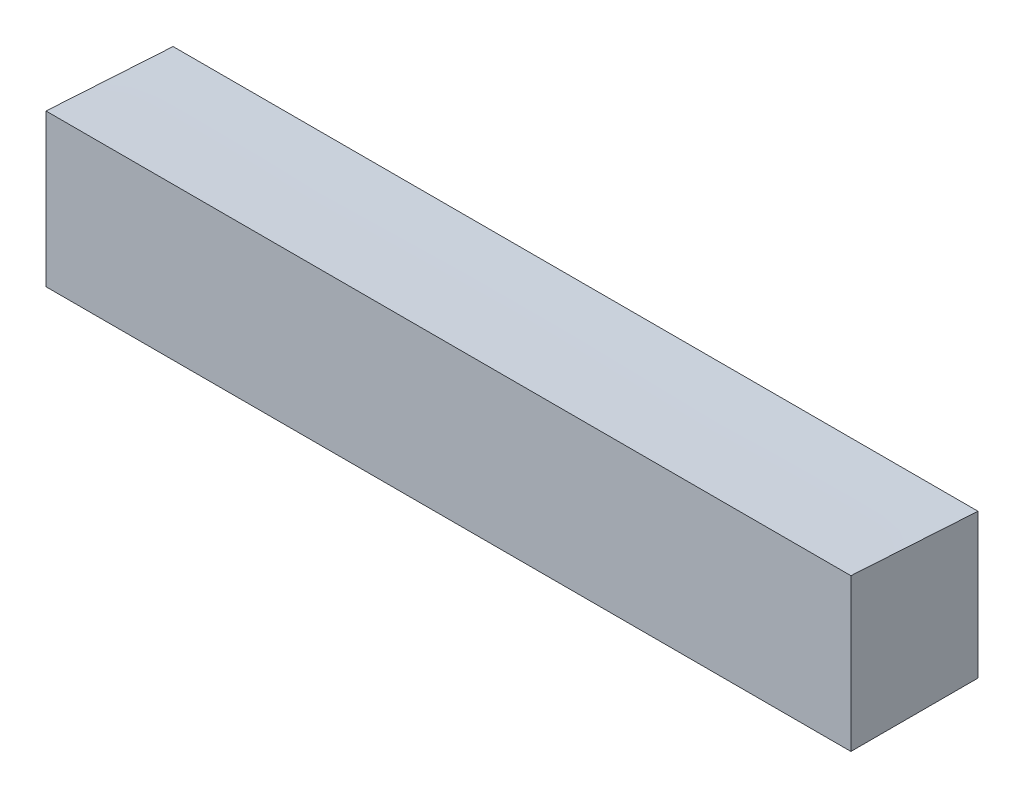
ISO-10303-21;
HEADER;
FILE_DESCRIPTION(('STEP AP214'),'2;1');
FILE_NAME('part.step','',(''),(''),'','','');
FILE_SCHEMA(('AUTOMOTIVE_DESIGN { 1 0 10303 214 1 1 1 1 }'));
ENDSEC;
DATA;
#1=APPLICATION_CONTEXT('core data for automotive mechanical design processes');
#2=APPLICATION_PROTOCOL_DEFINITION('international standard','automotive_design',2000,#1);
#3=PRODUCT_CONTEXT('',#1,'mechanical');
#4=PRODUCT('Part','Part','',(#3));
#5=PRODUCT_RELATED_PRODUCT_CATEGORY('part','',(#4));
#6=PRODUCT_DEFINITION_FORMATION('','',#4);
#7=PRODUCT_DEFINITION_CONTEXT('part definition',#1,'design');
#8=PRODUCT_DEFINITION('design','',#6,#7);
#9=PRODUCT_DEFINITION_SHAPE('','',#8);
#10=(LENGTH_UNIT() NAMED_UNIT(*) SI_UNIT(.MILLI.,.METRE.));
#11=(NAMED_UNIT(*) PLANE_ANGLE_UNIT() SI_UNIT($,.RADIAN.));
#12=(NAMED_UNIT(*) SI_UNIT($,.STERADIAN.) SOLID_ANGLE_UNIT());
#13=UNCERTAINTY_MEASURE_WITH_UNIT(LENGTH_MEASURE(1.E-05),#10,'distance_accuracy_value','');
#14=(GEOMETRIC_REPRESENTATION_CONTEXT(3) GLOBAL_UNCERTAINTY_ASSIGNED_CONTEXT((#13)) GLOBAL_UNIT_ASSIGNED_CONTEXT((#10,
#11,#12)) REPRESENTATION_CONTEXT('',''));
#15=CARTESIAN_POINT('',(0.,0.,0.));
#16=DIRECTION('',(0.,0.,1.));
#17=DIRECTION('',(1.,0.,0.));
#18=AXIS2_PLACEMENT_3D('',#15,#16,#17);
#19=CARTESIAN_POINT('',(-200.,-196.883488142695,0.));
#20=CARTESIAN_POINT('',(-200.,-189.069163208415,-93.0446551492894));
#21=CARTESIAN_POINT('',(-200.,-207.243937597042,-302.610093537368));
#22=CARTESIAN_POINT('',(-200.,-209.075197803941,-413.146581257138));
#23=CARTESIAN_POINT('',(-200.,-149.907972883575,-472.384774493397));
#24=CARTESIAN_POINT('',(-200.,-57.0358984147016,-361.760258551688));
#25=CARTESIAN_POINT('',(-200.,250.000000000014,-480.000000000005));
#26=B_SPLINE_CURVE_WITH_KNOTS('',3,(#19,#20,#21,#22,#23,#24,#25),.UNSPECIFIED.,.F.,.F.,(4,1,1,1,
4),(0.,0.361871867439847,0.526261734758969,0.755385014590914,1.),.UNSPECIFIED.);
#27=DIRECTION('',(1.,0.,0.));
#28=VECTOR('',#27,1.);
#29=SURFACE_OF_LINEAR_EXTRUSION('',#26,#28);
#30=OFFSET_SURFACE('',#29,10.,.F.);
#31=DIRECTION('',(1.,0.,0.));
#32=VECTOR('',#31,1.);
#33=CARTESIAN_POINT('',(1.67918436749914E-13,-214.063970017158,-285.));
#34=LINE('',#33,#32);
#35=CARTESIAN_POINT('',(-190.,-214.063970017158,-285.));
#36=VERTEX_POINT('',#35);
#37=CARTESIAN_POINT('',(0.,-214.063970017158,-285.));
#38=VERTEX_POINT('',#37);
#39=EDGE_CURVE('E113',#36,#38,#34,.T.);
#40=ORIENTED_EDGE('',*,*,#39,.T.);
#41=CARTESIAN_POINT('',(0.,-214.063970017158,-285.));
#42=CARTESIAN_POINT('',(0.,-214.169897603878,-286.666391276235));
#43=CARTESIAN_POINT('',(0.,-214.275412749037,-288.332808990086));
#44=CARTESIAN_POINT('',(0.,-214.485303277016,-291.665712523541));
#45=CARTESIAN_POINT('',(0.,-214.589678662312,-293.332198342988));
#46=CARTESIAN_POINT('',(0.,-214.796975092093,-296.665257949711));
#47=CARTESIAN_POINT('',(0.,-214.899896138855,-298.331831736845));
#48=CARTESIAN_POINT('',(0.,-215.103912061046,-301.665092410315));
#49=CARTESIAN_POINT('',(1.00130648115482E-13,-215.205006935139,-303.331779296734));
#50=CARTESIAN_POINT('',(1.00001231820377E-13,-215.404950577951,-306.665289524139));
#51=CARTESIAN_POINT('',(0.,-215.503799344788,-308.332112865239));
#52=CARTESIAN_POINT('',(1.02100759876928E-13,-215.698733649254,-311.66592616503));
#53=CARTESIAN_POINT('',(1.05218592612216E-13,-215.794819178308,-313.332916124223));
#54=CARTESIAN_POINT('',(1.12407860303751E-13,-215.889264261175,-315.));
#55=B_SPLINE_CURVE_WITH_KNOTS('',3,(#41,#42,#43,#44,#45,#46,#47,#48,#49,#50,#51,#52,#53,#54),
.UNSPECIFIED.,.F.,.F.,(4,2,2,2,2,2,4),(0.,5.00926418266521,10.0185174815807,15.0277629368888,
20.0370120556964,25.0462653692141,30.0555342255274),.UNSPECIFIED.);
#56=CARTESIAN_POINT('',(1.01526973962432E-13,-215.889264261175,-315.));
#57=VERTEX_POINT('',#56);
#58=EDGE_CURVE('E54',#38,#57,#55,.T.);
#59=ORIENTED_EDGE('',*,*,#58,.T.);
#60=DIRECTION('',(1.,0.,0.));
#61=VECTOR('',#60,1.);
#62=CARTESIAN_POINT('',(1.4016343591938E-13,-215.889264261175,-315.));
#63=LINE('',#62,#61);
#64=CARTESIAN_POINT('',(-190.,-215.889264261175,-315.));
#65=VERTEX_POINT('',#64);
#66=EDGE_CURVE('E48',#57,#65,#63,.F.);
#67=ORIENTED_EDGE('',*,*,#66,.T.);
#68=CARTESIAN_POINT('',(-190.,-206.848406491872,-0.83690040879665));
#69=CARTESIAN_POINT('',(-190.,-206.680899729474,-2.83196435834714));
#70=CARTESIAN_POINT('',(-190.,-206.524739920902,-4.82794940591907));
#71=CARTESIAN_POINT('',(-190.,-206.229758714729,-8.86783995350959));
#72=CARTESIAN_POINT('',(-190.,-206.091424591732,-10.9117811192717));
#73=CARTESIAN_POINT('',(-190.,-205.697632628618,-17.1755782071918));
#74=CARTESIAN_POINT('',(-190.,-205.474098659275,-21.3974546028109));
#75=CARTESIAN_POINT('',(-190.,-205.089308396329,-30.0026610464738));
#76=CARTESIAN_POINT('',(-190.,-204.930703285704,-34.3861057928549));
#77=CARTESIAN_POINT('',(-190.,-204.6723096484,-43.2949730817195));
#78=CARTESIAN_POINT('',(-190.,-204.574563993186,-47.8204536207943));
#79=CARTESIAN_POINT('',(-190.,-204.434143727457,-56.9941016438361));
#80=CARTESIAN_POINT('',(-190.,-204.393022699433,-61.642291834893));
#81=CARTESIAN_POINT('',(-190.,-204.361933921012,-71.0422741164044));
#82=CARTESIAN_POINT('',(-190.,-204.373125088734,-75.7940694243542));
#83=CARTESIAN_POINT('',(-190.,-204.442589942356,-85.3823239687476));
#84=CARTESIAN_POINT('',(-190.,-204.501702491738,-90.2187767666326));
#85=CARTESIAN_POINT('',(-190.,-204.662884106211,-99.9575193365573));
#86=CARTESIAN_POINT('',(-190.,-204.765533117713,-104.859799210251));
#87=CARTESIAN_POINT('',(-190.,-205.132650540976,-119.690886641539));
#88=CARTESIAN_POINT('',(-190.,-205.455107634532,-129.618269005237));
#89=CARTESIAN_POINT('',(-190.,-206.218795525464,-149.512537428811));
#90=CARTESIAN_POINT('',(-190.,-206.660548671311,-159.479402612641));
#91=CARTESIAN_POINT('',(-190.,-208.097850487291,-188.913348352305));
#92=CARTESIAN_POINT('',(-190.,-209.219720056613,-208.374164334439));
#93=CARTESIAN_POINT('',(-190.,-210.987613690559,-237.032066844139));
#94=CARTESIAN_POINT('',(-190.,-211.572827259253,-246.233228047827));
#95=CARTESIAN_POINT('',(-190.,-212.446836672774,-259.83862152767));
#96=CARTESIAN_POINT('',(-190.,-212.731126535985,-264.243125985354));
#97=CARTESIAN_POINT('',(-190.,-213.289060704734,-272.89722728791));
#98=CARTESIAN_POINT('',(-190.,-213.562727683203,-277.146822766935));
#99=CARTESIAN_POINT('',(-190.,-214.094769678484,-285.473164528526));
#100=CARTESIAN_POINT('',(-190.,-214.353313492666,-289.549899950289));
#101=CARTESIAN_POINT('',(-190.,-214.850441949062,-297.512733151689));
#102=CARTESIAN_POINT('',(-190.,-215.089394053153,-301.398807839575));
#103=CARTESIAN_POINT('',(-190.,-215.542421833008,-308.962767304756));
#104=CARTESIAN_POINT('',(-190.,-215.757144261278,-312.640613127198));
#105=CARTESIAN_POINT('',(-190.,-216.15767842579,-319.776181037423));
#106=CARTESIAN_POINT('',(-190.,-216.344452112103,-323.233848357707));
#107=CARTESIAN_POINT('',(-190.,-216.680486192346,-329.94153700421));
#108=CARTESIAN_POINT('',(-190.,-216.831331669813,-333.191476727294));
#109=CARTESIAN_POINT('',(-190.,-217.08595049588,-339.501988729252));
#110=CARTESIAN_POINT('',(-190.,-217.191969029704,-342.562466677417));
#111=CARTESIAN_POINT('',(-190.,-217.347340099764,-348.512402677128));
#112=CARTESIAN_POINT('',(-190.,-217.399548898466,-351.401780564259));
#113=CARTESIAN_POINT('',(-190.,-217.437258729537,-357.027840327293));
#114=CARTESIAN_POINT('',(-190.,-217.426151453857,-359.764491705852));
#115=CARTESIAN_POINT('',(-190.,-217.326743144481,-365.103122161024));
#116=CARTESIAN_POINT('',(-190.,-217.242231928415,-367.705162309784));
#117=CARTESIAN_POINT('',(-190.,-216.985030043556,-372.791926850525));
#118=CARTESIAN_POINT('',(-190.,-216.816325976363,-375.276841157314));
#119=CARTESIAN_POINT('',(-190.,-216.379390283407,-380.145421228546));
#120=CARTESIAN_POINT('',(-190.,-216.115075381989,-382.529428942616));
#121=CARTESIAN_POINT('',(-190.,-215.475380674847,-387.210742385725));
#122=CARTESIAN_POINT('',(-190.,-215.10354081459,-389.508516706862));
#123=CARTESIAN_POINT('',(-190.,-214.451082268095,-392.916253057906));
#124=CARTESIAN_POINT('',(-190.,-214.22027787381,-394.035865543185));
#125=CARTESIAN_POINT('',(-190.,-213.727353254093,-396.257772541768));
#126=CARTESIAN_POINT('',(-190.,-213.465529843328,-397.360132513627));
#127=CARTESIAN_POINT('',(-190.,-212.90934490599,-399.54865971033));
#128=CARTESIAN_POINT('',(-190.,-212.615216296005,-400.634886057611));
#129=CARTESIAN_POINT('',(-190.,-211.993369004565,-402.792168712012));
#130=CARTESIAN_POINT('',(-190.,-211.665814678645,-403.863272321521));
#131=CARTESIAN_POINT('',(-190.,-210.976442480095,-405.989846060897));
#132=CARTESIAN_POINT('',(-190.,-210.614761658881,-407.045360559698));
#133=CARTESIAN_POINT('',(-190.,-209.856642441995,-409.138797964619));
#134=CARTESIAN_POINT('',(-190.,-209.460357720043,-410.176776437627));
#135=CARTESIAN_POINT('',(-190.,-208.632475578434,-412.233096192294));
#136=CARTESIAN_POINT('',(-190.,-208.201046867728,-413.251505290433));
#137=CARTESIAN_POINT('',(-190.,-207.302225358477,-415.26658709377));
#138=CARTESIAN_POINT('',(-190.,-206.835012169975,-416.263339781266));
#139=CARTESIAN_POINT('',(-190.,-205.863874471296,-418.232937355987));
#140=CARTESIAN_POINT('',(-190.,-205.360135251458,-419.205873445784));
#141=CARTESIAN_POINT('',(-190.,-204.315100840248,-421.125568827787));
#142=CARTESIAN_POINT('',(-190.,-203.773990221215,-422.072428416929));
#143=CARTESIAN_POINT('',(-190.,-202.653275615583,-423.937573643505));
#144=CARTESIAN_POINT('',(-190.,-202.073847862406,-424.855964975864));
#145=CARTESIAN_POINT('',(-190.,-200.875484241904,-426.661608932179));
#146=CARTESIAN_POINT('',(-190.,-200.256707496636,-427.54896696487));
#147=CARTESIAN_POINT('',(-190.,-198.978571054947,-429.289776188998));
#148=CARTESIAN_POINT('',(-190.,-198.319343745931,-430.143324369179));
#149=CARTESIAN_POINT('',(-190.,-196.959242416487,-431.813468642932));
#150=CARTESIAN_POINT('',(-190.,-196.258463971665,-432.630142467503));
#151=CARTESIAN_POINT('',(-190.,-194.814158435088,-434.223270603683));
#152=CARTESIAN_POINT('',(-190.,-194.070680652332,-434.999769414184));
#153=CARTESIAN_POINT('',(-190.,-192.922978736205,-436.131368298507));
#154=CARTESIAN_POINT('',(-190.,-192.534991545494,-436.503048026284));
#155=CARTESIAN_POINT('',(-190.,-191.748028320033,-437.234936695569));
#156=CARTESIAN_POINT('',(-190.,-191.349047934296,-437.595140969973));
#157=CARTESIAN_POINT('',(-190.,-190.540035743604,-438.303546317665));
#158=CARTESIAN_POINT('',(-190.,-190.129995802685,-438.651738099706));
#159=CARTESIAN_POINT('',(-190.,-189.298809005686,-439.335581710445));
#160=CARTESIAN_POINT('',(-190.,-188.877650180739,-439.671219000767));
#161=CARTESIAN_POINT('',(-190.,-188.024201965795,-440.329390655713));
#162=CARTESIAN_POINT('',(-190.,-187.591896816373,-440.651904594766));
#163=CARTESIAN_POINT('',(-190.,-186.716163149998,-441.283248585974));
#164=CARTESIAN_POINT('',(-190.,-186.272715203689,-441.592051701354));
#165=CARTESIAN_POINT('',(-190.,-185.374739783985,-442.195376338106));
#166=CARTESIAN_POINT('',(-190.,-184.920189421378,-442.489863807975));
#167=CARTESIAN_POINT('',(-190.,-184.000093261762,-443.06394697904));
#168=CARTESIAN_POINT('',(-190.,-183.534521413077,-443.343500946001));
#169=CARTESIAN_POINT('',(-190.,-182.592510176358,-443.887099114829));
#170=CARTESIAN_POINT('',(-190.,-182.116041957033,-444.151093376444));
#171=CARTESIAN_POINT('',(-190.,-181.152412298376,-444.662951998329));
#172=CARTESIAN_POINT('',(-190.,-180.66521971025,-444.9107577418));
#173=CARTESIAN_POINT('',(-190.,-179.680363681935,-445.389623467796));
#174=CARTESIAN_POINT('',(-190.,-179.182667308238,-445.620615743395));
#175=CARTESIAN_POINT('',(-190.,-178.1770744751,-446.065249984083));
#176=CARTESIAN_POINT('',(-190.,-177.669143889956,-446.278814795585));
#177=CARTESIAN_POINT('',(-190.,-176.643400721545,-446.688008256435));
#178=CARTESIAN_POINT('',(-190.,-176.125553460959,-446.883550002813));
#179=CARTESIAN_POINT('',(-190.,-175.080339714544,-447.256137635738));
#180=CARTESIAN_POINT('',(-190.,-174.552938676629,-447.433086614169));
#181=CARTESIAN_POINT('',(-190.,-173.489020609486,-447.767962350359));
#182=CARTESIAN_POINT('',(-190.,-172.952469856015,-447.925781977363));
#183=CARTESIAN_POINT('',(-190.,-171.870690297951,-448.221912542186));
#184=CARTESIAN_POINT('',(-190.,-171.325429316785,-448.360105938194));
#185=CARTESIAN_POINT('',(-190.,-170.226694818797,-448.616543048131));
#186=CARTESIAN_POINT('',(-190.,-169.673191403955,-448.734658641859));
#187=CARTESIAN_POINT('',(-190.,-168.558456891737,-448.950548929727));
#188=CARTESIAN_POINT('',(-190.,-167.997198913117,-449.048184774707));
#189=CARTESIAN_POINT('',(-190.,-166.867450436745,-449.222776904159));
#190=CARTESIAN_POINT('',(-190.,-166.298936817892,-449.299583476186));
#191=CARTESIAN_POINT('',(-190.,-165.15517313261,-449.432232060989));
#192=CARTESIAN_POINT('',(-190.,-164.579904452414,-449.487913385525));
#193=CARTESIAN_POINT('',(-190.,-163.423118256496,-449.578079523875));
#194=CARTESIAN_POINT('',(-190.,-162.841587383374,-449.612392593291));
#195=CARTESIAN_POINT('',(-190.,-161.672747034352,-449.659641039567));
#196=CARTESIAN_POINT('',(-190.,-161.085430204629,-449.672393582274));
#197=CARTESIAN_POINT('',(-190.,-159.905462717753,-449.676386779282));
#198=CARTESIAN_POINT('',(-190.,-159.312811449488,-449.667433540854));
#199=CARTESIAN_POINT('',(-190.,-158.12258744824,-449.627922920725));
#200=CARTESIAN_POINT('',(-190.,-157.525021568557,-449.597160701174));
#201=CARTESIAN_POINT('',(-190.,-156.325342709072,-449.513975793326));
#202=CARTESIAN_POINT('',(-190.,-155.723244738952,-449.461337534733));
#203=CARTESIAN_POINT('',(-190.,-154.514833979895,-449.334373520626));
#204=CARTESIAN_POINT('',(-190.,-153.908545004899,-449.259821786912));
#205=CARTESIAN_POINT('',(-190.,-152.692039800474,-449.089026124344));
#206=CARTESIAN_POINT('',(-190.,-152.081856776564,-448.992546252874));
#207=CARTESIAN_POINT('',(-190.,-150.8578054187,-448.777905145958));
#208=CARTESIAN_POINT('',(-190.,-150.243980195928,-448.659498569156));
#209=CARTESIAN_POINT('',(-190.,-149.012840208221,-448.401023340597));
#210=CARTESIAN_POINT('',(-190.,-148.395578874953,-448.260700624457));
#211=CARTESIAN_POINT('',(-190.,-147.157720613185,-447.958416440662));
#212=CARTESIAN_POINT('',(-190.,-146.537187788355,-447.79619298806));
#213=CARTESIAN_POINT('',(-190.,-145.292889740189,-447.450122815611));
#214=CARTESIAN_POINT('',(-190.,-144.66919938239,-447.266006994332));
#215=CARTESIAN_POINT('',(-190.,-143.418684676956,-446.876179550672));
#216=CARTESIAN_POINT('',(-190.,-142.791946540861,-446.670192931452));
#217=CARTESIAN_POINT('',(-190.,-140.892346262428,-446.014719904194));
#218=CARTESIAN_POINT('',(-190.,-139.629453409923,-445.535931557919));
#219=CARTESIAN_POINT('',(-190.,-137.741313424412,-444.760299070792));
#220=CARTESIAN_POINT('',(-190.,-137.10551687113,-444.488625011567));
#221=CARTESIAN_POINT('',(-190.,-135.833351376189,-443.924472958441));
#222=CARTESIAN_POINT('',(-190.,-135.197081257116,-443.631771452008));
#223=CARTESIAN_POINT('',(-190.,-133.298901367262,-442.73124799881));
#224=CARTESIAN_POINT('',(-190.,-132.047668052924,-442.101026333054));
#225=CARTESIAN_POINT('',(-190.,-129.552683711011,-440.801507030489));
#226=CARTESIAN_POINT('',(-190.,-128.309083330141,-440.131926115796));
#227=CARTESIAN_POINT('',(-190.,-125.804092380674,-438.766551743186));
#228=CARTESIAN_POINT('',(-190.,-124.542842713502,-438.070501853988));
#229=CARTESIAN_POINT('',(-190.,-121.979068012845,-436.662411301967));
#230=CARTESIAN_POINT('',(-190.,-120.676455350504,-435.950528930046));
#231=CARTESIAN_POINT('',(-190.,-118.007940751132,-434.519482982449));
#232=CARTESIAN_POINT('',(-190.,-116.641584694367,-433.801158978827));
#233=CARTESIAN_POINT('',(-190.,-113.824553568488,-432.365398036719));
#234=CARTESIAN_POINT('',(-190.,-112.37299542901,-431.649682630415));
#235=CARTESIAN_POINT('',(-190.,-109.365055109549,-430.227305486088));
#236=CARTESIAN_POINT('',(-190.,-107.80736113623,-429.523404899872));
#237=CARTESIAN_POINT('',(-190.,-104.566867203116,-428.13321298125));
#238=CARTESIAN_POINT('',(-190.,-102.882380116109,-427.450842785472));
#239=CARTESIAN_POINT('',(-190.,-99.3681048852072,-426.112929051726));
#240=CARTESIAN_POINT('',(-190.,-97.5363514885188,-425.462541431636));
#241=CARTESIAN_POINT('',(-190.,-93.7074380834072,-424.198655158072));
#242=CARTESIAN_POINT('',(-190.,-91.7081635955179,-423.591566099555));
#243=CARTESIAN_POINT('',(-190.,-87.5242836403396,-422.425272867135));
#244=CARTESIAN_POINT('',(-190.,-85.3375591934523,-421.873689488976));
#245=CARTESIAN_POINT('',(-190.,-80.759162994672,-420.830333917941));
#246=CARTESIAN_POINT('',(-190.,-78.3655109169214,-420.347293232865));
#247=CARTESIAN_POINT('',(-190.,-73.3540675458149,-419.45379857025));
#248=CARTESIAN_POINT('',(-190.,-70.7345607102679,-419.053040029475));
#249=CARTESIAN_POINT('',(-190.,-65.2527174076372,-418.337600696241));
#250=CARTESIAN_POINT('',(-190.,-62.3890286614597,-418.033403029719));
#251=CARTESIAN_POINT('',(-190.,-56.4006601271487,-417.525134746128));
#252=CARTESIAN_POINT('',(-190.,-53.2750574571998,-417.332147050876));
#253=CARTESIAN_POINT('',(-190.,-46.7452110076733,-417.060750636511));
#254=CARTESIAN_POINT('',(-190.,-43.3405081344027,-416.993840498795));
#255=CARTESIAN_POINT('',(-190.,-36.2352722261545,-416.989316741283));
#256=CARTESIAN_POINT('',(-190.,-32.5347507811429,-417.063448192556));
#257=CARTESIAN_POINT('',(-190.,-24.8210812188987,-417.355880608669));
#258=CARTESIAN_POINT('',(-190.,-20.8084008284193,-417.586025608156));
#259=CARTESIAN_POINT('',(-190.,-12.4539353232368,-418.205431541476));
#260=CARTESIAN_POINT('',(-190.,-8.11304444931169,-418.606512370698));
#261=CARTESIAN_POINT('',(-190.,0.914072479054318,-419.582752922996));
#262=CARTESIAN_POINT('',(-190.,5.59901674519767,-420.16960964894));
#263=CARTESIAN_POINT('',(-190.,15.3302858776806,-421.532344863796));
#264=CARTESIAN_POINT('',(-190.,20.374985070204,-422.319721188753));
#265=CARTESIAN_POINT('',(-190.,30.8416765826227,-424.098396854754));
#266=CARTESIAN_POINT('',(-190.,36.2617442324815,-425.10093826696));
#267=CARTESIAN_POINT('',(-190.,47.4949938936284,-427.324792779908));
#268=CARTESIAN_POINT('',(-190.,53.305995959769,-428.557052145574));
#269=CARTESIAN_POINT('',(-190.,65.3368764501111,-431.255134650196));
#270=CARTESIAN_POINT('',(-190.,71.5543606912027,-432.731581713853));
#271=CARTESIAN_POINT('',(-190.,84.4139321931524,-435.932775414948));
#272=CARTESIAN_POINT('',(-190.,91.0534485309205,-437.667807844087));
#273=CARTESIAN_POINT('',(-190.,104.772793202531,-441.400854544702));
#274=CARTESIAN_POINT('',(-190.,111.849907478954,-443.408809031086));
#275=CARTESIAN_POINT('',(-190.,126.460150741597,-447.702332640811));
#276=CARTESIAN_POINT('',(-190.,133.990452114216,-449.997495314386));
#277=CARTESIAN_POINT('',(-190.,149.522778311725,-454.880022904477));
#278=CARTESIAN_POINT('',(-190.,157.52188800284,-457.47663832987));
#279=CARTESIAN_POINT('',(-190.,174.00753552938,-462.976619182039));
#280=CARTESIAN_POINT('',(-190.,182.491092129731,-465.888899182761));
#281=CARTESIAN_POINT('',(-190.,199.961402316681,-472.034717940555));
#282=CARTESIAN_POINT('',(-190.,208.945131087831,-475.27684461888));
#283=CARTESIAN_POINT('',(-190.,222.596366897664,-480.313104389418));
#284=CARTESIAN_POINT('',(-190.,227.280956388311,-482.061143348394));
#285=CARTESIAN_POINT('',(-190.,236.781446361964,-485.644035332574));
#286=CARTESIAN_POINT('',(-190.,241.596963136514,-487.479906069613));
#287=CARTESIAN_POINT('',(-190.,246.40626416593,-489.331937781346));
#288=B_SPLINE_CURVE_WITH_KNOTS('',3,(#68,#69,#70,#71,#72,#73,#74,#75,#76,#77,#78,#79,#80,#81,
#82,#83,#84,#85,#86,#87,#88,#89,#90,#91,#92,#93,#94,#95,#96,#97,#98,#99,#100,#101,#102,#103,
#104,#105,#106,#107,#108,#109,#110,#111,#112,#113,#114,#115,#116,#117,#118,#119,#120,#121,#122,
#123,#124,#125,#126,#127,#128,#129,#130,#131,#132,#133,#134,#135,#136,#137,#138,#139,#140,#141,
#142,#143,#144,#145,#146,#147,#148,#149,#150,#151,#152,#153,#154,#155,#156,#157,#158,#159,#160,
#161,#162,#163,#164,#165,#166,#167,#168,#169,#170,#171,#172,#173,#174,#175,#176,#177,#178,#179,
#180,#181,#182,#183,#184,#185,#186,#187,#188,#189,#190,#191,#192,#193,#194,#195,#196,#197,#198,
#199,#200,#201,#202,#203,#204,#205,#206,#207,#208,#209,#210,#211,#212,#213,#214,#215,#216,#217,
#218,#219,#220,#221,#222,#223,#224,#225,#226,#227,#228,#229,#230,#231,#232,#233,#234,#235,#236,
#237,#238,#239,#240,#241,#242,#243,#244,#245,#246,#247,#248,#249,#250,#251,#252,#253,#254,#255,
#256,#257,#258,#259,#260,#261,#262,#263,#264,#265,#266,#267,#268,#269,#270,#271,#272,#273,#274,
#275,#276,#277,#278,#279,#280,#281,#282,#283,#284,#285,#286,#287),.UNSPECIFIED.,.F.,.F.,(4,2,2,
2,2,2,2,2,2,2,2,2,2,2,2,2,2,2,2,2,2,2,2,2,2,2,2,2,2,2,2,2,2,2,2,2,2,2,2,2,2,2,2,2,2,2,2,2,2,2,2,
2,2,2,2,2,2,2,2,2,2,2,2,2,2,2,2,2,2,2,2,2,2,2,2,2,2,2,2,2,2,2,2,2,2,2,2,2,2,2,2,2,2,2,2,2,2,2,2,
2,2,2,2,2,2,2,2,2,2,4),(0.,6.00616812600453,12.1519167653748,24.8345222374942,37.9929541272527,
51.5721370337467,65.5169244394189,79.7720886970808,94.282320285502,108.992232666119,
138.789048351388,168.718508955115,227.195851528579,254.855190715289,268.096192984184,
280.871388903668,293.126161567196,304.806391939028,315.858695695924,326.246766550717,
336.006938425829,345.193583714362,353.862607447494,362.071771175223,369.880714596479,
377.350714603268,384.544107957686,391.523394076183,394.952429498747,398.35096376079,
401.726430294479,405.086033537666,408.432676593063,411.765147626857,415.082470295225,
418.384114652931,421.670046511134,424.940773098537,428.197381993567,431.441569484882,
434.675653713514,437.902567637347,441.125827272641,442.73750237018,444.34982478331,
445.963367519931,447.578724311101,449.196505969038,450.817336785296,452.441851130001,
454.070690478257,455.704501090139,457.343932550967,458.989637373116,460.642271861979,
462.302498303801,463.97098854936,465.648428919524,467.335526287346,469.033015109669,
470.741665040038,472.462288800648,474.195749832423,475.942969343951,477.704932378877,
479.482692523672,481.277375107128,483.090178663222,484.922374680145,486.77530567946,
488.650381750403,490.549075795852,492.47291767327,494.423487599741,496.402408979031,
500.451552220075,502.525589652717,504.626434975609,508.828274963022,513.065337891659,
517.38704453429,521.84031943342,526.470989139896,531.325512254823,536.452414008207,
541.903176406507,547.732562765125,553.998480330165,560.761539408908,568.084471238669,
576.031536089217,584.668006150884,594.059761368659,604.273001343258,615.374056279244,
627.429272549894,640.504949205914,654.667306445451,669.982472554585,686.516480613653,
704.335269836516,723.504688749373,744.090498863615,766.158378276374,789.773925040991,
815.002660321971,841.910031397885,870.561414585462,885.561619349176,901.022309016377),.UNSPECIFIED.);
#289=EDGE_CURVE('E116',#65,#36,#288,.F.);
#290=ORIENTED_EDGE('',*,*,#289,.T.);
#291=EDGE_LOOP('',(#40,#59,#67,#290));
#292=FACE_BOUND('',#291,.T.);
#293=ADVANCED_FACE('F38',(#292),#30,.F.);
#294=CARTESIAN_POINT('',(190.,250.002,-315.));
#295=DIRECTION('',(0.,0.,-1.));
#296=DIRECTION('',(-1.,0.,0.));
#297=AXIS2_PLACEMENT_3D('',#294,#295,#296);
#298=PLANE('',#297);
#299=DIRECTION('',(0.,1.,0.));
#300=VECTOR('',#299,1.);
#301=CARTESIAN_POINT('',(1.01526973962432E-13,-250.,-315.));
#302=LINE('',#301,#300);
#303=CARTESIAN_POINT('',(1.01526973962432E-13,-250.,-315.));
#304=VERTEX_POINT('',#303);
#305=EDGE_CURVE('E80',#304,#57,#302,.T.);
#306=ORIENTED_EDGE('',*,*,#305,.F.);
#307=DIRECTION('',(1.,0.,0.));
#308=VECTOR('',#307,1.);
#309=CARTESIAN_POINT('',(190.,-250.,-315.));
#310=LINE('',#309,#308);
#311=CARTESIAN_POINT('',(-190.,-250.,-315.));
#312=VERTEX_POINT('',#311);
#313=EDGE_CURVE('E90',#312,#304,#310,.T.);
#314=ORIENTED_EDGE('',*,*,#313,.F.);
#315=DIRECTION('',(0.,-1.,0.));
#316=VECTOR('',#315,1.);
#317=CARTESIAN_POINT('',(-190.,250.002,-315.));
#318=LINE('',#317,#316);
#319=EDGE_CURVE('E106',#65,#312,#318,.T.);
#320=ORIENTED_EDGE('',*,*,#319,.F.);
#321=ORIENTED_EDGE('',*,*,#66,.F.);
#322=EDGE_LOOP('',(#306,#314,#320,#321));
#323=FACE_BOUND('',#322,.T.);
#324=ADVANCED_FACE('F88',(#323),#298,.T.);
#325=CARTESIAN_POINT('',(0.,-250.,0.));
#326=DIRECTION('',(0.,1.,0.));
#327=DIRECTION('',(0.,0.,1.));
#328=AXIS2_PLACEMENT_3D('',#325,#326,#327);
#329=PLANE('',#328);
#330=ORIENTED_EDGE('',*,*,#313,.T.);
#331=DIRECTION('',(0.,0.,-1.));
#332=VECTOR('',#331,1.);
#333=CARTESIAN_POINT('',(0.,-250.,-273.295845960426));
#334=LINE('',#333,#332);
#335=CARTESIAN_POINT('',(0.,-250.,-285.));
#336=VERTEX_POINT('',#335);
#337=EDGE_CURVE('E77',#336,#304,#334,.T.);
#338=ORIENTED_EDGE('',*,*,#337,.F.);
#339=DIRECTION('',(-1.,0.,0.));
#340=VECTOR('',#339,1.);
#341=CARTESIAN_POINT('',(190.,-250.,-285.));
#342=LINE('',#341,#340);
#343=CARTESIAN_POINT('',(-190.,-250.,-285.));
#344=VERTEX_POINT('',#343);
#345=EDGE_CURVE('E101',#336,#344,#342,.T.);
#346=ORIENTED_EDGE('',*,*,#345,.T.);
#347=DIRECTION('',(0.,0.,-1.));
#348=VECTOR('',#347,1.);
#349=CARTESIAN_POINT('',(-190.,-250.,-285.));
#350=LINE('',#349,#348);
#351=EDGE_CURVE('E96',#344,#312,#350,.T.);
#352=ORIENTED_EDGE('',*,*,#351,.T.);
#353=EDGE_LOOP('',(#330,#338,#346,#352));
#354=FACE_BOUND('',#353,.T.);
#355=ADVANCED_FACE('F94',(#354),#329,.F.);
#356=CARTESIAN_POINT('',(-190.,250.002,-285.));
#357=DIRECTION('',(-1.,0.,0.));
#358=DIRECTION('',(0.,0.,1.));
#359=AXIS2_PLACEMENT_3D('',#356,#357,#358);
#360=PLANE('',#359);
#361=ORIENTED_EDGE('',*,*,#289,.F.);
#362=ORIENTED_EDGE('',*,*,#319,.T.);
#363=ORIENTED_EDGE('',*,*,#351,.F.);
#364=DIRECTION('',(0.,-1.,0.));
#365=VECTOR('',#364,1.);
#366=CARTESIAN_POINT('',(-190.,250.002,-285.));
#367=LINE('',#366,#365);
#368=EDGE_CURVE('E109',#36,#344,#367,.T.);
#369=ORIENTED_EDGE('',*,*,#368,.F.);
#370=EDGE_LOOP('',(#361,#362,#363,#369));
#371=FACE_BOUND('',#370,.T.);
#372=ADVANCED_FACE('F130',(#371),#360,.T.);
#373=CARTESIAN_POINT('',(190.,250.002,-285.));
#374=DIRECTION('',(0.,0.,1.));
#375=DIRECTION('',(1.,0.,0.));
#376=AXIS2_PLACEMENT_3D('',#373,#374,#375);
#377=PLANE('',#376);
#378=DIRECTION('',(0.,-1.,0.));
#379=VECTOR('',#378,1.);
#380=CARTESIAN_POINT('',(0.,250.002,-285.));
#381=LINE('',#380,#379);
#382=EDGE_CURVE('E11',#38,#336,#381,.T.);
#383=ORIENTED_EDGE('',*,*,#382,.F.);
#384=ORIENTED_EDGE('',*,*,#39,.F.);
#385=ORIENTED_EDGE('',*,*,#368,.T.);
#386=ORIENTED_EDGE('',*,*,#345,.F.);
#387=EDGE_LOOP('',(#383,#384,#385,#386));
#388=FACE_BOUND('',#387,.T.);
#389=ADVANCED_FACE('F131',(#388),#377,.T.);
#390=CARTESIAN_POINT('',(0.,-250.,-273.295845960426));
#391=DIRECTION('',(-1.,0.,0.));
#392=DIRECTION('',(0.,0.,1.));
#393=AXIS2_PLACEMENT_3D('',#390,#391,#392);
#394=PLANE('',#393);
#395=ORIENTED_EDGE('',*,*,#382,.T.);
#396=ORIENTED_EDGE('',*,*,#337,.T.);
#397=ORIENTED_EDGE('',*,*,#305,.T.);
#398=ORIENTED_EDGE('',*,*,#58,.F.);
#399=EDGE_LOOP('',(#395,#396,#397,#398));
#400=FACE_BOUND('',#399,.T.);
#401=ADVANCED_FACE('F79',(#400),#394,.F.);
#402=CLOSED_SHELL('',(#293,#324,#355,#372,#389,#401));
#403=MANIFOLD_SOLID_BREP('B2',#402);
#404=ADVANCED_BREP_SHAPE_REPRESENTATION('',(#18,#403),#14);
#405=SHAPE_DEFINITION_REPRESENTATION(#9,#404);
ENDSEC;
END-ISO-10303-21;
